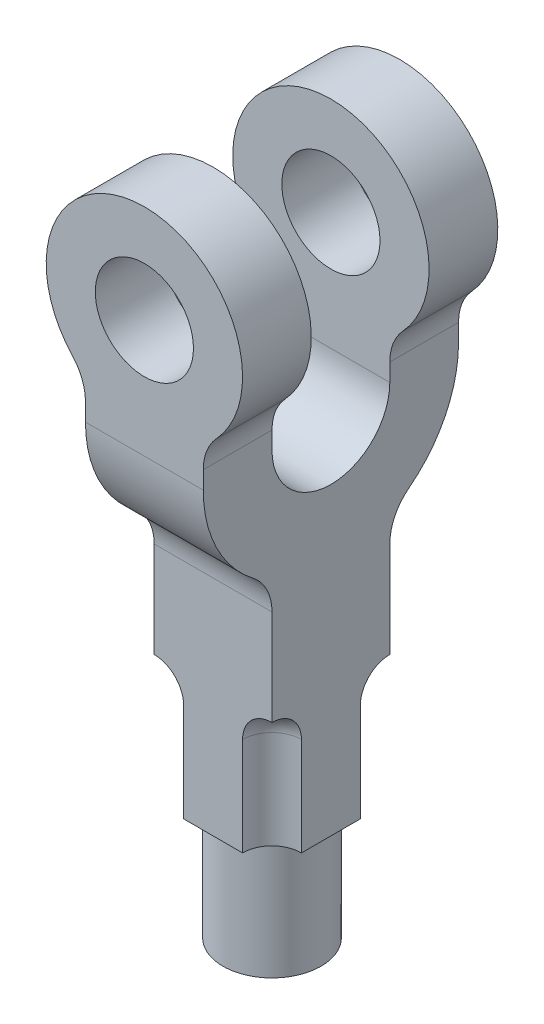
ISO-10303-21;
HEADER;
FILE_DESCRIPTION(('STEP AP214'),'2;1');
FILE_NAME('part.step','',(''),(''),'','','');
FILE_SCHEMA(('AUTOMOTIVE_DESIGN { 1 0 10303 214 1 1 1 1 }'));
ENDSEC;
DATA;
#1=APPLICATION_CONTEXT('core data for automotive mechanical design processes');
#2=APPLICATION_PROTOCOL_DEFINITION('international standard','automotive_design',2000,#1);
#3=PRODUCT_CONTEXT('',#1,'mechanical');
#4=PRODUCT('Part','Part','',(#3));
#5=PRODUCT_RELATED_PRODUCT_CATEGORY('part','',(#4));
#6=PRODUCT_DEFINITION_FORMATION('','',#4);
#7=PRODUCT_DEFINITION_CONTEXT('part definition',#1,'design');
#8=PRODUCT_DEFINITION('design','',#6,#7);
#9=PRODUCT_DEFINITION_SHAPE('','',#8);
#10=(LENGTH_UNIT() NAMED_UNIT(*) SI_UNIT(.MILLI.,.METRE.));
#11=(NAMED_UNIT(*) PLANE_ANGLE_UNIT() SI_UNIT($,.RADIAN.));
#12=(NAMED_UNIT(*) SI_UNIT($,.STERADIAN.) SOLID_ANGLE_UNIT());
#13=UNCERTAINTY_MEASURE_WITH_UNIT(LENGTH_MEASURE(1.E-05),#10,'distance_accuracy_value','');
#14=(GEOMETRIC_REPRESENTATION_CONTEXT(3) GLOBAL_UNCERTAINTY_ASSIGNED_CONTEXT((#13)) GLOBAL_UNIT_ASSIGNED_CONTEXT((#10,
#11,#12)) REPRESENTATION_CONTEXT('',''));
#15=CARTESIAN_POINT('',(0.,0.,0.));
#16=DIRECTION('',(0.,0.,1.));
#17=DIRECTION('',(1.,0.,0.));
#18=AXIS2_PLACEMENT_3D('',#15,#16,#17);
#19=CARTESIAN_POINT('',(24.,37.,12.));
#20=DIRECTION('',(0.,0.,1.));
#21=DIRECTION('',(0.,-1.,0.));
#22=AXIS2_PLACEMENT_3D('',#19,#20,#21);
#23=PLANE('',#22);
#24=CARTESIAN_POINT('',(12.,61.,12.));
#25=DIRECTION('',(0.,0.,1.));
#26=DIRECTION('',(0.,-1.,0.));
#27=AXIS2_PLACEMENT_3D('',#24,#25,#26);
#28=CIRCLE('',#27,10.);
#29=CARTESIAN_POINT('',(12.,51.,12.));
#30=VERTEX_POINT('',#29);
#31=EDGE_CURVE('E496',#30,#30,#28,.T.);
#32=ORIENTED_EDGE('',*,*,#31,.T.);
#33=EDGE_LOOP('',(#32));
#34=FACE_BOUND('',#33,.T.);
#35=DIRECTION('',(0.,1.,0.));
#36=VECTOR('',#35,1.);
#37=CARTESIAN_POINT('',(0.,37.,12.));
#38=LINE('',#37,#36);
#39=CARTESIAN_POINT('',(0.,37.,12.));
#40=VERTEX_POINT('',#39);
#41=CARTESIAN_POINT('',(0.,40.6039219456289,12.));
#42=VERTEX_POINT('',#41);
#43=EDGE_CURVE('E370',#40,#42,#38,.T.);
#44=ORIENTED_EDGE('',*,*,#43,.T.);
#45=CARTESIAN_POINT('',(-10.,40.6039219456289,12.));
#46=DIRECTION('',(0.,0.,1.));
#47=DIRECTION('',(0.,-1.,0.));
#48=AXIS2_PLACEMENT_3D('',#45,#46,#47);
#49=CIRCLE('',#48,10.);
#50=CARTESIAN_POINT('',(-2.66666666666667,47.4026146304192,12.));
#51=VERTEX_POINT('',#50);
#52=EDGE_CURVE('E528',#42,#51,#49,.T.);
#53=ORIENTED_EDGE('',*,*,#52,.T.);
#54=CARTESIAN_POINT('',(12.,61.,12.));
#55=DIRECTION('',(0.,0.,1.));
#56=DIRECTION('',(0.,-1.,0.));
#57=AXIS2_PLACEMENT_3D('',#54,#55,#56);
#58=CIRCLE('',#57,20.);
#59=CARTESIAN_POINT('',(26.6666666666667,47.4026146304192,12.));
#60=VERTEX_POINT('',#59);
#61=EDGE_CURVE('E732',#51,#60,#58,.F.);
#62=ORIENTED_EDGE('',*,*,#61,.T.);
#63=CARTESIAN_POINT('',(34.,40.6039219456289,12.));
#64=DIRECTION('',(0.,0.,1.));
#65=DIRECTION('',(0.,-1.,0.));
#66=AXIS2_PLACEMENT_3D('',#63,#64,#65);
#67=CIRCLE('',#66,10.);
#68=CARTESIAN_POINT('',(24.,40.6039219456289,12.));
#69=VERTEX_POINT('',#68);
#70=EDGE_CURVE('E540',#60,#69,#67,.T.);
#71=ORIENTED_EDGE('',*,*,#70,.T.);
#72=DIRECTION('',(0.,1.,0.));
#73=VECTOR('',#72,1.);
#74=CARTESIAN_POINT('',(24.,37.,12.));
#75=LINE('',#74,#73);
#76=CARTESIAN_POINT('',(24.,37.,12.));
#77=VERTEX_POINT('',#76);
#78=EDGE_CURVE('E450',#77,#69,#75,.T.);
#79=ORIENTED_EDGE('',*,*,#78,.F.);
#80=DIRECTION('',(-1.,0.,0.));
#81=VECTOR('',#80,1.);
#82=CARTESIAN_POINT('',(24.,37.,12.));
#83=LINE('',#82,#81);
#84=EDGE_CURVE('E396',#77,#40,#83,.T.);
#85=ORIENTED_EDGE('',*,*,#84,.T.);
#86=EDGE_LOOP('',(#44,#53,#62,#71,#79,#85));
#87=FACE_BOUND('',#86,.T.);
#88=ADVANCED_FACE('F117',(#34,#87),#23,.F.);
#89=CARTESIAN_POINT('',(24.,37.,26.));
#90=DIRECTION('',(0.,0.,1.));
#91=DIRECTION('',(0.,-1.,0.));
#92=AXIS2_PLACEMENT_3D('',#89,#90,#91);
#93=PLANE('',#92);
#94=CARTESIAN_POINT('',(12.,61.,26.));
#95=DIRECTION('',(0.,0.,1.));
#96=DIRECTION('',(1.,0.,0.));
#97=AXIS2_PLACEMENT_3D('',#94,#95,#96);
#98=CIRCLE('',#97,10.);
#99=CARTESIAN_POINT('',(22.,61.,26.));
#100=VERTEX_POINT('',#99);
#101=EDGE_CURVE('E1014',#100,#100,#98,.T.);
#102=ORIENTED_EDGE('',*,*,#101,.F.);
#103=EDGE_LOOP('',(#102));
#104=FACE_BOUND('',#103,.T.);
#105=DIRECTION('',(0.,1.,0.));
#106=VECTOR('',#105,1.);
#107=CARTESIAN_POINT('',(24.,37.,26.));
#108=LINE('',#107,#106);
#109=CARTESIAN_POINT('',(24.,37.,26.));
#110=VERTEX_POINT('',#109);
#111=CARTESIAN_POINT('',(24.,40.6039219456289,26.));
#112=VERTEX_POINT('',#111);
#113=EDGE_CURVE('E446',#110,#112,#108,.T.);
#114=ORIENTED_EDGE('',*,*,#113,.T.);
#115=CARTESIAN_POINT('',(34.,40.6039219456289,26.));
#116=DIRECTION('',(0.,0.,1.));
#117=DIRECTION('',(0.,-1.,0.));
#118=AXIS2_PLACEMENT_3D('',#115,#116,#117);
#119=CIRCLE('',#118,10.);
#120=CARTESIAN_POINT('',(26.6666666666667,47.4026146304192,26.));
#121=VERTEX_POINT('',#120);
#122=EDGE_CURVE('E537',#112,#121,#119,.F.);
#123=ORIENTED_EDGE('',*,*,#122,.T.);
#124=CARTESIAN_POINT('',(12.,61.,26.));
#125=DIRECTION('',(0.,0.,1.));
#126=DIRECTION('',(1.,0.,0.));
#127=AXIS2_PLACEMENT_3D('',#124,#125,#126);
#128=CIRCLE('',#127,20.);
#129=CARTESIAN_POINT('',(-2.66666666666667,47.4026146304192,26.));
#130=VERTEX_POINT('',#129);
#131=EDGE_CURVE('E726',#121,#130,#128,.T.);
#132=ORIENTED_EDGE('',*,*,#131,.T.);
#133=CARTESIAN_POINT('',(-10.,40.6039219456289,26.));
#134=DIRECTION('',(0.,0.,1.));
#135=DIRECTION('',(0.,-1.,0.));
#136=AXIS2_PLACEMENT_3D('',#133,#134,#135);
#137=CIRCLE('',#136,10.);
#138=CARTESIAN_POINT('',(0.,40.6039219456289,26.));
#139=VERTEX_POINT('',#138);
#140=EDGE_CURVE('E525',#130,#139,#137,.F.);
#141=ORIENTED_EDGE('',*,*,#140,.T.);
#142=DIRECTION('',(0.,1.,0.));
#143=VECTOR('',#142,1.);
#144=CARTESIAN_POINT('',(0.,37.,26.));
#145=LINE('',#144,#143);
#146=CARTESIAN_POINT('',(0.,37.,26.));
#147=VERTEX_POINT('',#146);
#148=EDGE_CURVE('E454',#147,#139,#145,.T.);
#149=ORIENTED_EDGE('',*,*,#148,.F.);
#150=DIRECTION('',(-1.,0.,0.));
#151=VECTOR('',#150,1.);
#152=CARTESIAN_POINT('',(24.,37.,26.));
#153=LINE('',#152,#151);
#154=EDGE_CURVE('E376',#110,#147,#153,.T.);
#155=ORIENTED_EDGE('',*,*,#154,.F.);
#156=EDGE_LOOP('',(#114,#123,#132,#141,#149,#155));
#157=FACE_BOUND('',#156,.T.);
#158=ADVANCED_FACE('F617',(#104,#157),#93,.T.);
#159=CARTESIAN_POINT('',(24.,37.,-26.));
#160=DIRECTION('',(0.,0.,1.));
#161=DIRECTION('',(0.,-1.,0.));
#162=AXIS2_PLACEMENT_3D('',#159,#160,#161);
#163=PLANE('',#162);
#164=CARTESIAN_POINT('',(12.,61.,-26.));
#165=DIRECTION('',(0.,0.,1.));
#166=DIRECTION('',(1.,0.,0.));
#167=AXIS2_PLACEMENT_3D('',#164,#165,#166);
#168=CIRCLE('',#167,10.);
#169=CARTESIAN_POINT('',(22.,61.,-26.));
#170=VERTEX_POINT('',#169);
#171=EDGE_CURVE('E497',#170,#170,#168,.T.);
#172=ORIENTED_EDGE('',*,*,#171,.T.);
#173=EDGE_LOOP('',(#172));
#174=FACE_BOUND('',#173,.T.);
#175=DIRECTION('',(0.,1.,0.));
#176=VECTOR('',#175,1.);
#177=CARTESIAN_POINT('',(0.,37.,-26.));
#178=LINE('',#177,#176);
#179=CARTESIAN_POINT('',(0.,37.,-26.));
#180=VERTEX_POINT('',#179);
#181=CARTESIAN_POINT('',(0.,40.6039219456289,-26.));
#182=VERTEX_POINT('',#181);
#183=EDGE_CURVE('E438',#180,#182,#178,.T.);
#184=ORIENTED_EDGE('',*,*,#183,.T.);
#185=CARTESIAN_POINT('',(-10.,40.6039219456289,-26.));
#186=DIRECTION('',(0.,0.,1.));
#187=DIRECTION('',(0.,-1.,0.));
#188=AXIS2_PLACEMENT_3D('',#185,#186,#187);
#189=CIRCLE('',#188,10.);
#190=CARTESIAN_POINT('',(-2.66666666666667,47.4026146304192,-26.));
#191=VERTEX_POINT('',#190);
#192=EDGE_CURVE('E534',#182,#191,#189,.T.);
#193=ORIENTED_EDGE('',*,*,#192,.T.);
#194=CARTESIAN_POINT('',(12.,61.,-26.));
#195=DIRECTION('',(0.,0.,1.));
#196=DIRECTION('',(1.,0.,0.));
#197=AXIS2_PLACEMENT_3D('',#194,#195,#196);
#198=CIRCLE('',#197,20.);
#199=CARTESIAN_POINT('',(26.6666666666667,47.4026146304192,-26.));
#200=VERTEX_POINT('',#199);
#201=EDGE_CURVE('E311',#200,#191,#198,.T.);
#202=ORIENTED_EDGE('',*,*,#201,.F.);
#203=CARTESIAN_POINT('',(34.,40.6039219456289,-26.));
#204=DIRECTION('',(0.,0.,1.));
#205=DIRECTION('',(0.,-1.,0.));
#206=AXIS2_PLACEMENT_3D('',#203,#204,#205);
#207=CIRCLE('',#206,10.);
#208=CARTESIAN_POINT('',(24.,40.6039219456289,-26.));
#209=VERTEX_POINT('',#208);
#210=EDGE_CURVE('E546',#200,#209,#207,.T.);
#211=ORIENTED_EDGE('',*,*,#210,.T.);
#212=DIRECTION('',(0.,1.,0.));
#213=VECTOR('',#212,1.);
#214=CARTESIAN_POINT('',(24.,37.,-26.));
#215=LINE('',#214,#213);
#216=CARTESIAN_POINT('',(24.,37.,-26.));
#217=VERTEX_POINT('',#216);
#218=EDGE_CURVE('E401',#217,#209,#215,.T.);
#219=ORIENTED_EDGE('',*,*,#218,.F.);
#220=DIRECTION('',(-1.,0.,0.));
#221=VECTOR('',#220,1.);
#222=CARTESIAN_POINT('',(24.,37.,-26.));
#223=LINE('',#222,#221);
#224=EDGE_CURVE('E421',#217,#180,#223,.T.);
#225=ORIENTED_EDGE('',*,*,#224,.T.);
#226=EDGE_LOOP('',(#184,#193,#202,#211,#219,#225));
#227=FACE_BOUND('',#226,.T.);
#228=ADVANCED_FACE('F624',(#174,#227),#163,.F.);
#229=CARTESIAN_POINT('',(24.,37.,-12.));
#230=DIRECTION('',(0.,0.,1.));
#231=DIRECTION('',(0.,-1.,0.));
#232=AXIS2_PLACEMENT_3D('',#229,#230,#231);
#233=PLANE('',#232);
#234=CARTESIAN_POINT('',(12.,61.,-12.));
#235=DIRECTION('',(0.,0.,1.));
#236=DIRECTION('',(0.,-1.,0.));
#237=AXIS2_PLACEMENT_3D('',#234,#235,#236);
#238=CIRCLE('',#237,10.);
#239=CARTESIAN_POINT('',(12.,51.,-12.));
#240=VERTEX_POINT('',#239);
#241=EDGE_CURVE('E492',#240,#240,#238,.T.);
#242=ORIENTED_EDGE('',*,*,#241,.F.);
#243=EDGE_LOOP('',(#242));
#244=FACE_BOUND('',#243,.T.);
#245=DIRECTION('',(0.,1.,0.));
#246=VECTOR('',#245,1.);
#247=CARTESIAN_POINT('',(24.,37.,-12.));
#248=LINE('',#247,#246);
#249=CARTESIAN_POINT('',(24.,37.,-12.));
#250=VERTEX_POINT('',#249);
#251=CARTESIAN_POINT('',(24.,40.6039219456289,-12.));
#252=VERTEX_POINT('',#251);
#253=EDGE_CURVE('E434',#250,#252,#248,.T.);
#254=ORIENTED_EDGE('',*,*,#253,.T.);
#255=CARTESIAN_POINT('',(34.,40.6039219456289,-12.));
#256=DIRECTION('',(0.,0.,1.));
#257=DIRECTION('',(0.,-1.,0.));
#258=AXIS2_PLACEMENT_3D('',#255,#256,#257);
#259=CIRCLE('',#258,10.);
#260=CARTESIAN_POINT('',(26.6666666666667,47.4026146304192,-12.));
#261=VERTEX_POINT('',#260);
#262=EDGE_CURVE('E543',#252,#261,#259,.F.);
#263=ORIENTED_EDGE('',*,*,#262,.T.);
#264=CARTESIAN_POINT('',(12.,61.,-12.));
#265=DIRECTION('',(0.,0.,1.));
#266=DIRECTION('',(1.,0.,0.));
#267=AXIS2_PLACEMENT_3D('',#264,#265,#266);
#268=CIRCLE('',#267,20.);
#269=CARTESIAN_POINT('',(-2.66666666666667,47.4026146304192,-12.));
#270=VERTEX_POINT('',#269);
#271=EDGE_CURVE('E736',#261,#270,#268,.T.);
#272=ORIENTED_EDGE('',*,*,#271,.T.);
#273=CARTESIAN_POINT('',(-10.,40.6039219456289,-12.));
#274=DIRECTION('',(0.,0.,1.));
#275=DIRECTION('',(0.,-1.,0.));
#276=AXIS2_PLACEMENT_3D('',#273,#274,#275);
#277=CIRCLE('',#276,10.);
#278=CARTESIAN_POINT('',(0.,40.6039219456289,-12.));
#279=VERTEX_POINT('',#278);
#280=EDGE_CURVE('E531',#270,#279,#277,.F.);
#281=ORIENTED_EDGE('',*,*,#280,.T.);
#282=DIRECTION('',(0.,1.,0.));
#283=VECTOR('',#282,1.);
#284=CARTESIAN_POINT('',(0.,37.,-12.));
#285=LINE('',#284,#283);
#286=CARTESIAN_POINT('',(0.,37.,-12.));
#287=VERTEX_POINT('',#286);
#288=EDGE_CURVE('E442',#287,#279,#285,.T.);
#289=ORIENTED_EDGE('',*,*,#288,.F.);
#290=DIRECTION('',(-1.,0.,0.));
#291=VECTOR('',#290,1.);
#292=CARTESIAN_POINT('',(24.,37.,-12.));
#293=LINE('',#292,#291);
#294=EDGE_CURVE('E418',#250,#287,#293,.T.);
#295=ORIENTED_EDGE('',*,*,#294,.F.);
#296=EDGE_LOOP('',(#254,#263,#272,#281,#289,#295));
#297=FACE_BOUND('',#296,.T.);
#298=ADVANCED_FACE('F700',(#244,#297),#233,.T.);
#299=CARTESIAN_POINT('',(24.,37.,0.));
#300=DIRECTION('',(-1.,0.,0.));
#301=DIRECTION('',(0.,0.,1.));
#302=AXIS2_PLACEMENT_3D('',#299,#300,#301);
#303=CYLINDRICAL_SURFACE('',#302,26.);
#304=CARTESIAN_POINT('',(0.,37.,0.));
#305=DIRECTION('',(1.,0.,0.));
#306=DIRECTION('',(0.,0.,-1.));
#307=AXIS2_PLACEMENT_3D('',#304,#305,#306);
#308=CIRCLE('',#307,26.);
#309=CARTESIAN_POINT('',(0.,16.4198345517694,15.8888888888889));
#310=VERTEX_POINT('',#309);
#311=EDGE_CURVE('E397',#147,#310,#308,.T.);
#312=ORIENTED_EDGE('',*,*,#311,.T.);
#313=DIRECTION('',(-1.,0.,0.));
#314=VECTOR('',#313,1.);
#315=CARTESIAN_POINT('',(24.,16.4198345517694,15.8888888888889));
#316=LINE('',#315,#314);
#317=CARTESIAN_POINT('',(24.,16.4198345517694,15.8888888888889));
#318=VERTEX_POINT('',#317);
#319=EDGE_CURVE('E133',#310,#318,#316,.F.);
#320=ORIENTED_EDGE('',*,*,#319,.T.);
#321=CARTESIAN_POINT('',(24.,37.,0.));
#322=DIRECTION('',(1.,0.,0.));
#323=DIRECTION('',(0.,0.,-1.));
#324=AXIS2_PLACEMENT_3D('',#321,#322,#323);
#325=CIRCLE('',#324,26.);
#326=EDGE_CURVE('E377',#110,#318,#325,.T.);
#327=ORIENTED_EDGE('',*,*,#326,.F.);
#328=ORIENTED_EDGE('',*,*,#154,.T.);
#329=EDGE_LOOP('',(#312,#320,#327,#328));
#330=FACE_BOUND('',#329,.T.);
#331=ADVANCED_FACE('F697',(#330),#303,.T.);
#332=CARTESIAN_POINT('',(24.,0.,12.));
#333=DIRECTION('',(0.,0.,-1.));
#334=DIRECTION('',(0.,1.,0.));
#335=AXIS2_PLACEMENT_3D('',#332,#333,#334);
#336=PLANE('',#335);
#337=DIRECTION('',(0.,-1.,0.));
#338=VECTOR('',#337,1.);
#339=CARTESIAN_POINT('',(24.,0.,12.));
#340=LINE('',#339,#338);
#341=CARTESIAN_POINT('',(24.,8.50438630244999,12.));
#342=VERTEX_POINT('',#341);
#343=CARTESIAN_POINT('',(24.,-11.,12.));
#344=VERTEX_POINT('',#343);
#345=EDGE_CURVE('E380',#342,#344,#340,.T.);
#346=ORIENTED_EDGE('',*,*,#345,.F.);
#347=DIRECTION('',(1.,0.,0.));
#348=VECTOR('',#347,1.);
#349=CARTESIAN_POINT('',(0.,8.50438630244999,12.));
#350=LINE('',#349,#348);
#351=CARTESIAN_POINT('',(0.,8.50438630244999,12.));
#352=VERTEX_POINT('',#351);
#353=EDGE_CURVE('E556',#342,#352,#350,.F.);
#354=ORIENTED_EDGE('',*,*,#353,.T.);
#355=DIRECTION('',(0.,-1.,0.));
#356=VECTOR('',#355,1.);
#357=CARTESIAN_POINT('',(0.,0.,12.));
#358=LINE('',#357,#356);
#359=CARTESIAN_POINT('',(0.,-11.,12.));
#360=VERTEX_POINT('',#359);
#361=EDGE_CURVE('E400',#352,#360,#358,.T.);
#362=ORIENTED_EDGE('',*,*,#361,.T.);
#363=CARTESIAN_POINT('',(0.,-17.,12.));
#364=DIRECTION('',(0.,0.,-1.));
#365=DIRECTION('',(0.,1.,0.));
#366=AXIS2_PLACEMENT_3D('',#363,#364,#365);
#367=CIRCLE('',#366,6.);
#368=CARTESIAN_POINT('',(5.99999999999996,-17.,12.));
#369=VERTEX_POINT('',#368);
#370=EDGE_CURVE('E345',#369,#360,#367,.F.);
#371=ORIENTED_EDGE('',*,*,#370,.F.);
#372=DIRECTION('',(0.,1.,0.));
#373=VECTOR('',#372,1.);
#374=CARTESIAN_POINT('',(5.99999999999996,13.9348748106584,12.));
#375=LINE('',#374,#373);
#376=CARTESIAN_POINT('',(5.99999999999996,-37.,12.));
#377=VERTEX_POINT('',#376);
#378=EDGE_CURVE('E349',#377,#369,#375,.T.);
#379=ORIENTED_EDGE('',*,*,#378,.F.);
#380=DIRECTION('',(-1.,0.,0.));
#381=VECTOR('',#380,1.);
#382=CARTESIAN_POINT('',(24.,-37.,12.));
#383=LINE('',#382,#381);
#384=CARTESIAN_POINT('',(18.,-37.,12.));
#385=VERTEX_POINT('',#384);
#386=EDGE_CURVE('E428',#385,#377,#383,.T.);
#387=ORIENTED_EDGE('',*,*,#386,.F.);
#388=DIRECTION('',(0.,1.,0.));
#389=VECTOR('',#388,1.);
#390=CARTESIAN_POINT('',(18.,13.9348748106584,12.));
#391=LINE('',#390,#389);
#392=CARTESIAN_POINT('',(18.,-17.,12.));
#393=VERTEX_POINT('',#392);
#394=EDGE_CURVE('E363',#393,#385,#391,.F.);
#395=ORIENTED_EDGE('',*,*,#394,.F.);
#396=CARTESIAN_POINT('',(24.,-17.,12.));
#397=DIRECTION('',(0.,0.,-1.));
#398=DIRECTION('',(0.,1.,0.));
#399=AXIS2_PLACEMENT_3D('',#396,#397,#398);
#400=CIRCLE('',#399,6.);
#401=EDGE_CURVE('E360',#344,#393,#400,.F.);
#402=ORIENTED_EDGE('',*,*,#401,.F.);
#403=EDGE_LOOP('',(#346,#354,#362,#371,#379,#387,#395,#402));
#404=FACE_BOUND('',#403,.T.);
#405=ADVANCED_FACE('F602',(#404),#336,.F.);
#406=CARTESIAN_POINT('',(24.,-37.,0.));
#407=DIRECTION('',(0.,-1.,0.));
#408=DIRECTION('',(0.,0.,-1.));
#409=AXIS2_PLACEMENT_3D('',#406,#407,#408);
#410=PLANE('',#409);
#411=CARTESIAN_POINT('',(12.,-37.,0.));
#412=DIRECTION('',(0.,-1.,0.));
#413=DIRECTION('',(0.,0.,-1.));
#414=AXIS2_PLACEMENT_3D('',#411,#412,#413);
#415=CIRCLE('',#414,10.);
#416=CARTESIAN_POINT('',(12.,-37.,-10.));
#417=VERTEX_POINT('',#416);
#418=EDGE_CURVE('E371',#417,#417,#415,.T.);
#419=ORIENTED_EDGE('',*,*,#418,.F.);
#420=EDGE_LOOP('',(#419));
#421=FACE_BOUND('',#420,.T.);
#422=DIRECTION('',(-1.,0.,0.));
#423=VECTOR('',#422,1.);
#424=CARTESIAN_POINT('',(24.,-37.,-12.));
#425=LINE('',#424,#423);
#426=CARTESIAN_POINT('',(18.0000000000001,-37.,-12.));
#427=VERTEX_POINT('',#426);
#428=CARTESIAN_POINT('',(6.,-37.,-12.));
#429=VERTEX_POINT('',#428);
#430=EDGE_CURVE('E425',#427,#429,#425,.T.);
#431=ORIENTED_EDGE('',*,*,#430,.F.);
#432=CARTESIAN_POINT('',(24.0000000000001,-37.,-11.9999999999999));
#433=DIRECTION('',(0.,1.,0.));
#434=DIRECTION('',(1.,0.,0.));
#435=AXIS2_PLACEMENT_3D('',#432,#433,#434);
#436=CIRCLE('',#435,6.);
#437=CARTESIAN_POINT('',(24.,-37.,-5.99999999999988));
#438=VERTEX_POINT('',#437);
#439=EDGE_CURVE('E297',#427,#438,#436,.T.);
#440=ORIENTED_EDGE('',*,*,#439,.T.);
#441=DIRECTION('',(0.,0.,1.));
#442=VECTOR('',#441,1.);
#443=CARTESIAN_POINT('',(24.,-37.,0.));
#444=LINE('',#443,#442);
#445=CARTESIAN_POINT('',(24.,-37.,5.99999999999999));
#446=VERTEX_POINT('',#445);
#447=EDGE_CURVE('E384',#438,#446,#444,.T.);
#448=ORIENTED_EDGE('',*,*,#447,.T.);
#449=CARTESIAN_POINT('',(24.,-37.,12.));
#450=DIRECTION('',(0.,1.,0.));
#451=DIRECTION('',(0.,0.,1.));
#452=AXIS2_PLACEMENT_3D('',#449,#450,#451);
#453=CIRCLE('',#452,6.);
#454=EDGE_CURVE('E356',#446,#385,#453,.T.);
#455=ORIENTED_EDGE('',*,*,#454,.T.);
#456=ORIENTED_EDGE('',*,*,#386,.T.);
#457=CARTESIAN_POINT('',(0.,-37.,12.));
#458=DIRECTION('',(0.,1.,0.));
#459=DIRECTION('',(-1.,0.,0.));
#460=AXIS2_PLACEMENT_3D('',#457,#458,#459);
#461=CIRCLE('',#460,6.);
#462=CARTESIAN_POINT('',(0.,-37.,5.99999999999996));
#463=VERTEX_POINT('',#462);
#464=EDGE_CURVE('E341',#377,#463,#461,.T.);
#465=ORIENTED_EDGE('',*,*,#464,.T.);
#466=DIRECTION('',(0.,0.,1.));
#467=VECTOR('',#466,1.);
#468=CARTESIAN_POINT('',(0.,-37.,0.));
#469=LINE('',#468,#467);
#470=CARTESIAN_POINT('',(0.,-37.,-5.99999999999999));
#471=VERTEX_POINT('',#470);
#472=EDGE_CURVE('E404',#471,#463,#469,.T.);
#473=ORIENTED_EDGE('',*,*,#472,.F.);
#474=CARTESIAN_POINT('',(0.,-37.,-12.));
#475=DIRECTION('',(0.,1.,0.));
#476=DIRECTION('',(0.,0.,-1.));
#477=AXIS2_PLACEMENT_3D('',#474,#475,#476);
#478=CIRCLE('',#477,6.);
#479=EDGE_CURVE('E325',#471,#429,#478,.T.);
#480=ORIENTED_EDGE('',*,*,#479,.T.);
#481=EDGE_LOOP('',(#431,#440,#448,#455,#456,#465,#473,#480));
#482=FACE_BOUND('',#481,.T.);
#483=ADVANCED_FACE('F593',(#421,#482),#410,.T.);
#484=CARTESIAN_POINT('',(24.,0.,-12.));
#485=DIRECTION('',(0.,0.,-1.));
#486=DIRECTION('',(0.,1.,0.));
#487=AXIS2_PLACEMENT_3D('',#484,#485,#486);
#488=PLANE('',#487);
#489=DIRECTION('',(0.,-1.,0.));
#490=VECTOR('',#489,1.);
#491=CARTESIAN_POINT('',(0.,0.,-12.));
#492=LINE('',#491,#490);
#493=CARTESIAN_POINT('',(0.,8.50438630244998,-12.));
#494=VERTEX_POINT('',#493);
#495=CARTESIAN_POINT('',(0.,-11.,-12.));
#496=VERTEX_POINT('',#495);
#497=EDGE_CURVE('E407',#494,#496,#492,.T.);
#498=ORIENTED_EDGE('',*,*,#497,.F.);
#499=DIRECTION('',(-1.,0.,0.));
#500=VECTOR('',#499,1.);
#501=CARTESIAN_POINT('',(24.,8.50438630244998,-12.));
#502=LINE('',#501,#500);
#503=CARTESIAN_POINT('',(24.,8.50438630244998,-12.));
#504=VERTEX_POINT('',#503);
#505=EDGE_CURVE('E553',#494,#504,#502,.F.);
#506=ORIENTED_EDGE('',*,*,#505,.T.);
#507=DIRECTION('',(0.,-1.,0.));
#508=VECTOR('',#507,1.);
#509=CARTESIAN_POINT('',(24.,0.,-12.));
#510=LINE('',#509,#508);
#511=CARTESIAN_POINT('',(24.,-11.,-12.));
#512=VERTEX_POINT('',#511);
#513=EDGE_CURVE('E316',#504,#512,#510,.T.);
#514=ORIENTED_EDGE('',*,*,#513,.T.);
#515=CARTESIAN_POINT('',(24.0000000000001,-17.,-12.));
#516=DIRECTION('',(0.,0.,-1.));
#517=DIRECTION('',(0.,1.,0.));
#518=AXIS2_PLACEMENT_3D('',#515,#516,#517);
#519=CIRCLE('',#518,6.);
#520=CARTESIAN_POINT('',(18.0000000000001,-17.,-12.));
#521=VERTEX_POINT('',#520);
#522=EDGE_CURVE('E303',#512,#521,#519,.F.);
#523=ORIENTED_EDGE('',*,*,#522,.T.);
#524=DIRECTION('',(0.,1.,0.));
#525=VECTOR('',#524,1.);
#526=CARTESIAN_POINT('',(18.0000000000001,13.9348748106584,-12.));
#527=LINE('',#526,#525);
#528=EDGE_CURVE('E291',#521,#427,#527,.F.);
#529=ORIENTED_EDGE('',*,*,#528,.T.);
#530=ORIENTED_EDGE('',*,*,#430,.T.);
#531=DIRECTION('',(0.,1.,0.));
#532=VECTOR('',#531,1.);
#533=CARTESIAN_POINT('',(6.,13.9348748106584,-12.));
#534=LINE('',#533,#532);
#535=CARTESIAN_POINT('',(6.,-17.,-12.));
#536=VERTEX_POINT('',#535);
#537=EDGE_CURVE('E333',#429,#536,#534,.T.);
#538=ORIENTED_EDGE('',*,*,#537,.T.);
#539=CARTESIAN_POINT('',(0.,-17.,-12.));
#540=DIRECTION('',(0.,0.,-1.));
#541=DIRECTION('',(0.,1.,0.));
#542=AXIS2_PLACEMENT_3D('',#539,#540,#541);
#543=CIRCLE('',#542,6.);
#544=EDGE_CURVE('E329',#536,#496,#543,.F.);
#545=ORIENTED_EDGE('',*,*,#544,.T.);
#546=EDGE_LOOP('',(#498,#506,#514,#523,#529,#530,#538,#545));
#547=FACE_BOUND('',#546,.T.);
#548=ADVANCED_FACE('F314',(#547),#488,.T.);
#549=CARTESIAN_POINT('',(24.,37.,0.));
#550=DIRECTION('',(-1.,0.,0.));
#551=DIRECTION('',(0.,0.,1.));
#552=AXIS2_PLACEMENT_3D('',#549,#550,#551);
#553=CYLINDRICAL_SURFACE('',#552,26.);
#554=CARTESIAN_POINT('',(24.,37.,0.));
#555=DIRECTION('',(1.,0.,0.));
#556=DIRECTION('',(0.,0.,-1.));
#557=AXIS2_PLACEMENT_3D('',#554,#555,#556);
#558=CIRCLE('',#557,26.);
#559=CARTESIAN_POINT('',(24.,16.4198345517694,-15.8888888888889));
#560=VERTEX_POINT('',#559);
#561=EDGE_CURVE('E389',#560,#217,#558,.T.);
#562=ORIENTED_EDGE('',*,*,#561,.F.);
#563=DIRECTION('',(-1.,0.,0.));
#564=VECTOR('',#563,1.);
#565=CARTESIAN_POINT('',(24.,16.4198345517694,-15.8888888888889));
#566=LINE('',#565,#564);
#567=CARTESIAN_POINT('',(0.,16.4198345517694,-15.8888888888889));
#568=VERTEX_POINT('',#567);
#569=EDGE_CURVE('E549',#560,#568,#566,.T.);
#570=ORIENTED_EDGE('',*,*,#569,.T.);
#571=CARTESIAN_POINT('',(0.,37.,0.));
#572=DIRECTION('',(1.,0.,0.));
#573=DIRECTION('',(0.,0.,-1.));
#574=AXIS2_PLACEMENT_3D('',#571,#572,#573);
#575=CIRCLE('',#574,26.);
#576=EDGE_CURVE('E410',#568,#180,#575,.T.);
#577=ORIENTED_EDGE('',*,*,#576,.T.);
#578=ORIENTED_EDGE('',*,*,#224,.F.);
#579=EDGE_LOOP('',(#562,#570,#577,#578));
#580=FACE_BOUND('',#579,.T.);
#581=ADVANCED_FACE('F577',(#580),#553,.T.);
#582=CARTESIAN_POINT('',(24.,37.,0.));
#583=DIRECTION('',(-1.,0.,0.));
#584=DIRECTION('',(0.,0.,1.));
#585=AXIS2_PLACEMENT_3D('',#582,#583,#584);
#586=CYLINDRICAL_SURFACE('',#585,12.);
#587=CARTESIAN_POINT('',(0.,37.,0.));
#588=DIRECTION('',(1.,0.,0.));
#589=DIRECTION('',(0.,0.,-1.));
#590=AXIS2_PLACEMENT_3D('',#587,#588,#589);
#591=CIRCLE('',#590,12.);
#592=EDGE_CURVE('E381',#40,#287,#591,.T.);
#593=ORIENTED_EDGE('',*,*,#592,.F.);
#594=ORIENTED_EDGE('',*,*,#84,.F.);
#595=CARTESIAN_POINT('',(24.,37.,0.));
#596=DIRECTION('',(1.,0.,0.));
#597=DIRECTION('',(0.,0.,-1.));
#598=AXIS2_PLACEMENT_3D('',#595,#596,#597);
#599=CIRCLE('',#598,12.);
#600=EDGE_CURVE('E392',#77,#250,#599,.T.);
#601=ORIENTED_EDGE('',*,*,#600,.T.);
#602=ORIENTED_EDGE('',*,*,#294,.T.);
#603=EDGE_LOOP('',(#593,#594,#601,#602));
#604=FACE_BOUND('',#603,.T.);
#605=ADVANCED_FACE('F684',(#604),#586,.F.);
#606=CARTESIAN_POINT('',(0.,0.,0.));
#607=DIRECTION('',(1.,0.,0.));
#608=DIRECTION('',(0.,0.,-1.));
#609=AXIS2_PLACEMENT_3D('',#606,#607,#608);
#610=PLANE('',#609);
#611=ORIENTED_EDGE('',*,*,#148,.T.);
#612=DIRECTION('',(0.,0.,1.));
#613=VECTOR('',#612,1.);
#614=CARTESIAN_POINT('',(0.,40.6039219456289,0.));
#615=LINE('',#614,#613);
#616=EDGE_CURVE('E507',#139,#42,#615,.F.);
#617=ORIENTED_EDGE('',*,*,#616,.T.);
#618=ORIENTED_EDGE('',*,*,#43,.F.);
#619=ORIENTED_EDGE('',*,*,#592,.T.);
#620=ORIENTED_EDGE('',*,*,#288,.T.);
#621=DIRECTION('',(0.,0.,1.));
#622=VECTOR('',#621,1.);
#623=CARTESIAN_POINT('',(0.,40.6039219456289,0.));
#624=LINE('',#623,#622);
#625=EDGE_CURVE('E504',#279,#182,#624,.F.);
#626=ORIENTED_EDGE('',*,*,#625,.T.);
#627=ORIENTED_EDGE('',*,*,#183,.F.);
#628=ORIENTED_EDGE('',*,*,#576,.F.);
#629=CARTESIAN_POINT('',(0.,8.50438630244998,-22.));
#630=DIRECTION('',(1.,0.,0.));
#631=DIRECTION('',(0.,0.,-1.));
#632=AXIS2_PLACEMENT_3D('',#629,#630,#631);
#633=CIRCLE('',#632,10.);
#634=EDGE_CURVE('E562',#568,#494,#633,.T.);
#635=ORIENTED_EDGE('',*,*,#634,.T.);
#636=ORIENTED_EDGE('',*,*,#497,.T.);
#637=CARTESIAN_POINT('',(0.,-17.,-12.));
#638=DIRECTION('',(1.,0.,0.));
#639=DIRECTION('',(0.,0.,-1.));
#640=AXIS2_PLACEMENT_3D('',#637,#638,#639);
#641=CIRCLE('',#640,6.);
#642=CARTESIAN_POINT('',(0.,-17.,-5.99999999999999));
#643=VERTEX_POINT('',#642);
#644=EDGE_CURVE('E478',#643,#496,#641,.F.);
#645=ORIENTED_EDGE('',*,*,#644,.F.);
#646=DIRECTION('',(0.,1.,0.));
#647=VECTOR('',#646,1.);
#648=CARTESIAN_POINT('',(0.,13.9348748106584,-6.));
#649=LINE('',#648,#647);
#650=EDGE_CURVE('E482',#471,#643,#649,.T.);
#651=ORIENTED_EDGE('',*,*,#650,.F.);
#652=ORIENTED_EDGE('',*,*,#472,.T.);
#653=DIRECTION('',(0.,1.,0.));
#654=VECTOR('',#653,1.);
#655=CARTESIAN_POINT('',(0.,13.9348748106584,5.99999999999996));
#656=LINE('',#655,#654);
#657=CARTESIAN_POINT('',(0.,-17.,5.99999999999996));
#658=VERTEX_POINT('',#657);
#659=EDGE_CURVE('E474',#658,#463,#656,.F.);
#660=ORIENTED_EDGE('',*,*,#659,.F.);
#661=CARTESIAN_POINT('',(0.,-17.,12.));
#662=DIRECTION('',(1.,0.,0.));
#663=DIRECTION('',(0.,0.,-1.));
#664=AXIS2_PLACEMENT_3D('',#661,#662,#663);
#665=CIRCLE('',#664,6.);
#666=EDGE_CURVE('E471',#360,#658,#665,.F.);
#667=ORIENTED_EDGE('',*,*,#666,.F.);
#668=ORIENTED_EDGE('',*,*,#361,.F.);
#669=CARTESIAN_POINT('',(0.,8.50438630244998,22.));
#670=DIRECTION('',(1.,0.,0.));
#671=DIRECTION('',(0.,0.,-1.));
#672=AXIS2_PLACEMENT_3D('',#669,#670,#671);
#673=CIRCLE('',#672,10.);
#674=EDGE_CURVE('E126',#352,#310,#673,.T.);
#675=ORIENTED_EDGE('',*,*,#674,.T.);
#676=ORIENTED_EDGE('',*,*,#311,.F.);
#677=EDGE_LOOP('',(#611,#617,#618,#619,#620,#626,#627,#628,#635,#636,#645,#651,#652,#660,#667,
#668,#675,#676));
#678=FACE_BOUND('',#677,.T.);
#679=ADVANCED_FACE('F581',(#678),#610,.F.);
#680=CARTESIAN_POINT('',(24.,0.,0.));
#681=DIRECTION('',(1.,0.,0.));
#682=DIRECTION('',(0.,0.,-1.));
#683=AXIS2_PLACEMENT_3D('',#680,#681,#682);
#684=PLANE('',#683);
#685=ORIENTED_EDGE('',*,*,#78,.T.);
#686=DIRECTION('',(0.,0.,-1.));
#687=VECTOR('',#686,1.);
#688=CARTESIAN_POINT('',(24.,40.6039219456289,26.));
#689=LINE('',#688,#687);
#690=EDGE_CURVE('E521',#69,#112,#689,.F.);
#691=ORIENTED_EDGE('',*,*,#690,.T.);
#692=ORIENTED_EDGE('',*,*,#113,.F.);
#693=ORIENTED_EDGE('',*,*,#326,.T.);
#694=CARTESIAN_POINT('',(24.,8.50438630244998,22.));
#695=DIRECTION('',(1.,0.,0.));
#696=DIRECTION('',(0.,0.,-1.));
#697=AXIS2_PLACEMENT_3D('',#694,#695,#696);
#698=CIRCLE('',#697,10.);
#699=EDGE_CURVE('E12',#318,#342,#698,.F.);
#700=ORIENTED_EDGE('',*,*,#699,.T.);
#701=ORIENTED_EDGE('',*,*,#345,.T.);
#702=CARTESIAN_POINT('',(24.,-17.,12.));
#703=DIRECTION('',(1.,0.,0.));
#704=DIRECTION('',(0.,0.,-1.));
#705=AXIS2_PLACEMENT_3D('',#702,#703,#704);
#706=CIRCLE('',#705,6.);
#707=CARTESIAN_POINT('',(24.,-17.,5.99999999999999));
#708=VERTEX_POINT('',#707);
#709=EDGE_CURVE('E375',#344,#708,#706,.F.);
#710=ORIENTED_EDGE('',*,*,#709,.T.);
#711=DIRECTION('',(0.,1.,0.));
#712=VECTOR('',#711,1.);
#713=CARTESIAN_POINT('',(24.,13.9348748106584,6.));
#714=LINE('',#713,#712);
#715=EDGE_CURVE('E467',#708,#446,#714,.F.);
#716=ORIENTED_EDGE('',*,*,#715,.T.);
#717=ORIENTED_EDGE('',*,*,#447,.F.);
#718=DIRECTION('',(0.,1.,0.));
#719=VECTOR('',#718,1.);
#720=CARTESIAN_POINT('',(24.,13.9348748106584,-5.99999999999988));
#721=LINE('',#720,#719);
#722=CARTESIAN_POINT('',(24.,-17.,-5.99999999999988));
#723=VERTEX_POINT('',#722);
#724=EDGE_CURVE('E488',#438,#723,#721,.T.);
#725=ORIENTED_EDGE('',*,*,#724,.T.);
#726=CARTESIAN_POINT('',(24.,-17.,-11.9999999999999));
#727=DIRECTION('',(1.,0.,0.));
#728=DIRECTION('',(0.,0.,-1.));
#729=AXIS2_PLACEMENT_3D('',#726,#727,#728);
#730=CIRCLE('',#729,6.);
#731=EDGE_CURVE('E309',#723,#512,#730,.F.);
#732=ORIENTED_EDGE('',*,*,#731,.T.);
#733=ORIENTED_EDGE('',*,*,#513,.F.);
#734=CARTESIAN_POINT('',(24.,8.50438630244998,-22.));
#735=DIRECTION('',(1.,0.,0.));
#736=DIRECTION('',(0.,0.,-1.));
#737=AXIS2_PLACEMENT_3D('',#734,#735,#736);
#738=CIRCLE('',#737,10.);
#739=EDGE_CURVE('E565',#504,#560,#738,.F.);
#740=ORIENTED_EDGE('',*,*,#739,.T.);
#741=ORIENTED_EDGE('',*,*,#561,.T.);
#742=ORIENTED_EDGE('',*,*,#218,.T.);
#743=DIRECTION('',(0.,0.,-1.));
#744=VECTOR('',#743,1.);
#745=CARTESIAN_POINT('',(24.,40.6039219456289,-12.));
#746=LINE('',#745,#744);
#747=EDGE_CURVE('E517',#209,#252,#746,.F.);
#748=ORIENTED_EDGE('',*,*,#747,.T.);
#749=ORIENTED_EDGE('',*,*,#253,.F.);
#750=ORIENTED_EDGE('',*,*,#600,.F.);
#751=EDGE_LOOP('',(#685,#691,#692,#693,#700,#701,#710,#716,#717,#725,#732,#733,#740,#741,#742,
#748,#749,#750));
#752=FACE_BOUND('',#751,.T.);
#753=ADVANCED_FACE('F571',(#752),#684,.T.);
#754=CARTESIAN_POINT('',(12.,-61.,0.));
#755=DIRECTION('',(0.,1.,0.));
#756=DIRECTION('',(0.,0.,1.));
#757=AXIS2_PLACEMENT_3D('',#754,#755,#756);
#758=CYLINDRICAL_SURFACE('',#757,10.);
#759=CARTESIAN_POINT('',(12.,-61.,0.));
#760=DIRECTION('',(0.,-1.,0.));
#761=DIRECTION('',(0.,0.,-1.));
#762=AXIS2_PLACEMENT_3D('',#759,#760,#761);
#763=CIRCLE('',#762,10.);
#764=CARTESIAN_POINT('',(12.,-61.,-10.));
#765=VERTEX_POINT('',#764);
#766=EDGE_CURVE('E366',#765,#765,#763,.T.);
#767=ORIENTED_EDGE('',*,*,#766,.F.);
#768=EDGE_LOOP('',(#767));
#769=FACE_BOUND('',#768,.T.);
#770=ORIENTED_EDGE('',*,*,#418,.T.);
#771=EDGE_LOOP('',(#770));
#772=FACE_BOUND('',#771,.T.);
#773=ADVANCED_FACE('F674',(#769,#772),#758,.T.);
#774=CARTESIAN_POINT('',(12.,-61.,0.));
#775=DIRECTION('',(0.,-1.,0.));
#776=DIRECTION('',(0.,0.,-1.));
#777=AXIS2_PLACEMENT_3D('',#774,#775,#776);
#778=PLANE('',#777);
#779=ORIENTED_EDGE('',*,*,#766,.T.);
#780=EDGE_LOOP('',(#779));
#781=FACE_BOUND('',#780,.T.);
#782=ADVANCED_FACE('F667',(#781),#778,.T.);
#783=CARTESIAN_POINT('',(24.,13.9348748106584,12.));
#784=DIRECTION('',(0.,1.,0.));
#785=DIRECTION('',(0.,0.,1.));
#786=AXIS2_PLACEMENT_3D('',#783,#784,#785);
#787=CYLINDRICAL_SURFACE('',#786,6.);
#788=ORIENTED_EDGE('',*,*,#394,.T.);
#789=ORIENTED_EDGE('',*,*,#454,.F.);
#790=ORIENTED_EDGE('',*,*,#715,.F.);
#791=CARTESIAN_POINT('',(24.,-17.,12.));
#792=DIRECTION('',(0.,1.,0.));
#793=DIRECTION('',(0.,0.,1.));
#794=AXIS2_PLACEMENT_3D('',#791,#792,#793);
#795=CIRCLE('',#794,6.);
#796=EDGE_CURVE('E352',#708,#393,#795,.T.);
#797=ORIENTED_EDGE('',*,*,#796,.T.);
#798=EDGE_LOOP('',(#788,#789,#790,#797));
#799=FACE_BOUND('',#798,.T.);
#800=ADVANCED_FACE('F663',(#799),#787,.F.);
#801=CARTESIAN_POINT('',(24.,-17.,12.));
#802=DIRECTION('',(0.,1.,0.));
#803=DIRECTION('',(0.,0.,-1.));
#804=AXIS2_PLACEMENT_3D('',#801,#802,#803);
#805=SPHERICAL_SURFACE('',#804,6.);
#806=ORIENTED_EDGE('',*,*,#401,.T.);
#807=ORIENTED_EDGE('',*,*,#796,.F.);
#808=ORIENTED_EDGE('',*,*,#709,.F.);
#809=EDGE_LOOP('',(#806,#807,#808));
#810=FACE_BOUND('',#809,.T.);
#811=ADVANCED_FACE('F614',(#810),#805,.F.);
#812=CARTESIAN_POINT('',(0.,13.9348748106584,12.));
#813=DIRECTION('',(0.,1.,0.));
#814=DIRECTION('',(-1.,0.,0.));
#815=AXIS2_PLACEMENT_3D('',#812,#813,#814);
#816=CYLINDRICAL_SURFACE('',#815,6.);
#817=ORIENTED_EDGE('',*,*,#378,.T.);
#818=CARTESIAN_POINT('',(0.,-17.,12.));
#819=DIRECTION('',(0.,1.,0.));
#820=DIRECTION('',(-1.,0.,0.));
#821=AXIS2_PLACEMENT_3D('',#818,#819,#820);
#822=CIRCLE('',#821,6.);
#823=EDGE_CURVE('E337',#369,#658,#822,.T.);
#824=ORIENTED_EDGE('',*,*,#823,.T.);
#825=ORIENTED_EDGE('',*,*,#659,.T.);
#826=ORIENTED_EDGE('',*,*,#464,.F.);
#827=EDGE_LOOP('',(#817,#824,#825,#826));
#828=FACE_BOUND('',#827,.T.);
#829=ADVANCED_FACE('F597',(#828),#816,.F.);
#830=CARTESIAN_POINT('',(0.,-17.,12.));
#831=DIRECTION('',(0.,1.,0.));
#832=DIRECTION('',(1.,0.,0.));
#833=AXIS2_PLACEMENT_3D('',#830,#831,#832);
#834=SPHERICAL_SURFACE('',#833,6.);
#835=ORIENTED_EDGE('',*,*,#370,.T.);
#836=ORIENTED_EDGE('',*,*,#666,.T.);
#837=ORIENTED_EDGE('',*,*,#823,.F.);
#838=EDGE_LOOP('',(#835,#836,#837));
#839=FACE_BOUND('',#838,.T.);
#840=ADVANCED_FACE('F606',(#839),#834,.F.);
#841=CARTESIAN_POINT('',(0.,13.9348748106584,-12.));
#842=DIRECTION('',(0.,1.,0.));
#843=DIRECTION('',(0.,0.,-1.));
#844=AXIS2_PLACEMENT_3D('',#841,#842,#843);
#845=CYLINDRICAL_SURFACE('',#844,6.);
#846=ORIENTED_EDGE('',*,*,#479,.F.);
#847=ORIENTED_EDGE('',*,*,#650,.T.);
#848=CARTESIAN_POINT('',(0.,-17.,-12.));
#849=DIRECTION('',(0.,1.,0.));
#850=DIRECTION('',(0.,0.,-1.));
#851=AXIS2_PLACEMENT_3D('',#848,#849,#850);
#852=CIRCLE('',#851,6.);
#853=EDGE_CURVE('E302',#643,#536,#852,.T.);
#854=ORIENTED_EDGE('',*,*,#853,.T.);
#855=ORIENTED_EDGE('',*,*,#537,.F.);
#856=EDGE_LOOP('',(#846,#847,#854,#855));
#857=FACE_BOUND('',#856,.T.);
#858=ADVANCED_FACE('F588',(#857),#845,.F.);
#859=CARTESIAN_POINT('',(0.,-17.,-12.));
#860=DIRECTION('',(0.,1.,0.));
#861=DIRECTION('',(0.,0.,1.));
#862=AXIS2_PLACEMENT_3D('',#859,#860,#861);
#863=SPHERICAL_SURFACE('',#862,6.);
#864=ORIENTED_EDGE('',*,*,#853,.F.);
#865=ORIENTED_EDGE('',*,*,#644,.T.);
#866=ORIENTED_EDGE('',*,*,#544,.F.);
#867=EDGE_LOOP('',(#864,#865,#866));
#868=FACE_BOUND('',#867,.T.);
#869=ADVANCED_FACE('F586',(#868),#863,.F.);
#870=CARTESIAN_POINT('',(24.0000000000001,13.9348748106584,-11.9999999999999));
#871=DIRECTION('',(0.,1.,0.));
#872=DIRECTION('',(1.,0.,0.));
#873=AXIS2_PLACEMENT_3D('',#870,#871,#872);
#874=CYLINDRICAL_SURFACE('',#873,6.);
#875=CARTESIAN_POINT('',(24.0000000000001,-17.,-11.9999999999999));
#876=DIRECTION('',(0.,1.,0.));
#877=DIRECTION('',(1.,0.,0.));
#878=AXIS2_PLACEMENT_3D('',#875,#876,#877);
#879=CIRCLE('',#878,6.);
#880=EDGE_CURVE('E294',#521,#723,#879,.T.);
#881=ORIENTED_EDGE('',*,*,#880,.T.);
#882=ORIENTED_EDGE('',*,*,#724,.F.);
#883=ORIENTED_EDGE('',*,*,#439,.F.);
#884=ORIENTED_EDGE('',*,*,#528,.F.);
#885=EDGE_LOOP('',(#881,#882,#883,#884));
#886=FACE_BOUND('',#885,.T.);
#887=ADVANCED_FACE('F293',(#886),#874,.F.);
#888=CARTESIAN_POINT('',(24.0000000000001,-17.,-11.9999999999999));
#889=DIRECTION('',(0.,1.,0.));
#890=DIRECTION('',(-1.,0.,0.));
#891=AXIS2_PLACEMENT_3D('',#888,#889,#890);
#892=SPHERICAL_SURFACE('',#891,6.);
#893=ORIENTED_EDGE('',*,*,#731,.F.);
#894=ORIENTED_EDGE('',*,*,#880,.F.);
#895=ORIENTED_EDGE('',*,*,#522,.F.);
#896=EDGE_LOOP('',(#893,#894,#895));
#897=FACE_BOUND('',#896,.T.);
#898=ADVANCED_FACE('F307',(#897),#892,.F.);
#899=CARTESIAN_POINT('',(12.,61.,-26.));
#900=DIRECTION('',(0.,0.,1.));
#901=DIRECTION('',(1.,0.,0.));
#902=AXIS2_PLACEMENT_3D('',#899,#900,#901);
#903=CYLINDRICAL_SURFACE('',#902,20.);
#904=ORIENTED_EDGE('',*,*,#201,.T.);
#905=DIRECTION('',(0.,0.,1.));
#906=VECTOR('',#905,1.);
#907=CARTESIAN_POINT('',(-2.66666666666667,47.4026146304192,-26.));
#908=LINE('',#907,#906);
#909=EDGE_CURVE('E513',#191,#270,#908,.T.);
#910=ORIENTED_EDGE('',*,*,#909,.T.);
#911=ORIENTED_EDGE('',*,*,#271,.F.);
#912=DIRECTION('',(0.,0.,1.));
#913=VECTOR('',#912,1.);
#914=CARTESIAN_POINT('',(26.6666666666667,47.4026146304192,-26.));
#915=LINE('',#914,#913);
#916=EDGE_CURVE('E510',#261,#200,#915,.F.);
#917=ORIENTED_EDGE('',*,*,#916,.T.);
#918=EDGE_LOOP('',(#904,#910,#911,#917));
#919=FACE_BOUND('',#918,.T.);
#920=ADVANCED_FACE('F747',(#919),#903,.T.);
#921=CARTESIAN_POINT('',(12.,61.,-20.9848450049413));
#922=DIRECTION('',(0.,0.,1.));
#923=DIRECTION('',(1.,0.,0.));
#924=AXIS2_PLACEMENT_3D('',#921,#922,#923);
#925=CYLINDRICAL_SURFACE('',#924,20.);
#926=ORIENTED_EDGE('',*,*,#61,.F.);
#927=DIRECTION('',(0.,0.,1.));
#928=VECTOR('',#927,1.);
#929=CARTESIAN_POINT('',(-2.66666666666667,47.4026146304192,-20.9848450049413));
#930=LINE('',#929,#928);
#931=EDGE_CURVE('E500',#51,#130,#930,.T.);
#932=ORIENTED_EDGE('',*,*,#931,.T.);
#933=ORIENTED_EDGE('',*,*,#131,.F.);
#934=DIRECTION('',(0.,0.,1.));
#935=VECTOR('',#934,1.);
#936=CARTESIAN_POINT('',(26.6666666666667,47.4026146304192,-20.9848450049413));
#937=LINE('',#936,#935);
#938=EDGE_CURVE('E491',#121,#60,#937,.F.);
#939=ORIENTED_EDGE('',*,*,#938,.T.);
#940=EDGE_LOOP('',(#926,#932,#933,#939));
#941=FACE_BOUND('',#940,.T.);
#942=ADVANCED_FACE('F729',(#941),#925,.T.);
#943=CARTESIAN_POINT('',(12.,61.,-26.));
#944=DIRECTION('',(0.,0.,1.));
#945=DIRECTION('',(1.,0.,0.));
#946=AXIS2_PLACEMENT_3D('',#943,#944,#945);
#947=CYLINDRICAL_SURFACE('',#946,10.);
#948=ORIENTED_EDGE('',*,*,#241,.T.);
#949=EDGE_LOOP('',(#948));
#950=FACE_BOUND('',#949,.T.);
#951=ORIENTED_EDGE('',*,*,#171,.F.);
#952=EDGE_LOOP('',(#951));
#953=FACE_BOUND('',#952,.T.);
#954=ADVANCED_FACE('F761',(#950,#953),#947,.F.);
#955=ORIENTED_EDGE('',*,*,#101,.T.);
#956=EDGE_LOOP('',(#955));
#957=FACE_BOUND('',#956,.T.);
#958=ORIENTED_EDGE('',*,*,#31,.F.);
#959=EDGE_LOOP('',(#958));
#960=FACE_BOUND('',#959,.T.);
#961=ADVANCED_FACE('F635',(#957,#960),#947,.F.);
#962=CARTESIAN_POINT('',(-10.,40.6039219456289,-20.9848450049413));
#963=DIRECTION('',(0.,0.,1.));
#964=DIRECTION('',(1.,0.,0.));
#965=AXIS2_PLACEMENT_3D('',#962,#963,#964);
#966=CYLINDRICAL_SURFACE('',#965,10.);
#967=ORIENTED_EDGE('',*,*,#52,.F.);
#968=ORIENTED_EDGE('',*,*,#616,.F.);
#969=ORIENTED_EDGE('',*,*,#140,.F.);
#970=ORIENTED_EDGE('',*,*,#931,.F.);
#971=EDGE_LOOP('',(#967,#968,#969,#970));
#972=FACE_BOUND('',#971,.T.);
#973=ADVANCED_FACE('F631',(#972),#966,.F.);
#974=CARTESIAN_POINT('',(-10.,40.6039219456289,-26.));
#975=DIRECTION('',(0.,0.,1.));
#976=DIRECTION('',(1.,0.,0.));
#977=AXIS2_PLACEMENT_3D('',#974,#975,#976);
#978=CYLINDRICAL_SURFACE('',#977,10.);
#979=ORIENTED_EDGE('',*,*,#192,.F.);
#980=ORIENTED_EDGE('',*,*,#625,.F.);
#981=ORIENTED_EDGE('',*,*,#280,.F.);
#982=ORIENTED_EDGE('',*,*,#909,.F.);
#983=EDGE_LOOP('',(#979,#980,#981,#982));
#984=FACE_BOUND('',#983,.T.);
#985=ADVANCED_FACE('F634',(#984),#978,.F.);
#986=CARTESIAN_POINT('',(34.,40.6039219456289,-20.9848450049413));
#987=DIRECTION('',(0.,0.,1.));
#988=DIRECTION('',(1.,0.,0.));
#989=AXIS2_PLACEMENT_3D('',#986,#987,#988);
#990=CYLINDRICAL_SURFACE('',#989,10.);
#991=ORIENTED_EDGE('',*,*,#70,.F.);
#992=ORIENTED_EDGE('',*,*,#938,.F.);
#993=ORIENTED_EDGE('',*,*,#122,.F.);
#994=ORIENTED_EDGE('',*,*,#690,.F.);
#995=EDGE_LOOP('',(#991,#992,#993,#994));
#996=FACE_BOUND('',#995,.T.);
#997=ADVANCED_FACE('F639',(#996),#990,.F.);
#998=CARTESIAN_POINT('',(34.,40.6039219456289,-26.));
#999=DIRECTION('',(0.,0.,1.));
#1000=DIRECTION('',(1.,0.,0.));
#1001=AXIS2_PLACEMENT_3D('',#998,#999,#1000);
#1002=CYLINDRICAL_SURFACE('',#1001,10.);
#1003=ORIENTED_EDGE('',*,*,#210,.F.);
#1004=ORIENTED_EDGE('',*,*,#916,.F.);
#1005=ORIENTED_EDGE('',*,*,#262,.F.);
#1006=ORIENTED_EDGE('',*,*,#747,.F.);
#1007=EDGE_LOOP('',(#1003,#1004,#1005,#1006));
#1008=FACE_BOUND('',#1007,.T.);
#1009=ADVANCED_FACE('F643',(#1008),#1002,.F.);
#1010=CARTESIAN_POINT('',(24.,8.50438630244998,-22.));
#1011=DIRECTION('',(-1.,0.,0.));
#1012=DIRECTION('',(0.,0.,1.));
#1013=AXIS2_PLACEMENT_3D('',#1010,#1011,#1012);
#1014=CYLINDRICAL_SURFACE('',#1013,10.);
#1015=ORIENTED_EDGE('',*,*,#739,.F.);
#1016=ORIENTED_EDGE('',*,*,#505,.F.);
#1017=ORIENTED_EDGE('',*,*,#634,.F.);
#1018=ORIENTED_EDGE('',*,*,#569,.F.);
#1019=EDGE_LOOP('',(#1015,#1016,#1017,#1018));
#1020=FACE_BOUND('',#1019,.T.);
#1021=ADVANCED_FACE('F580',(#1020),#1014,.F.);
#1022=CARTESIAN_POINT('',(24.,8.50438630244998,22.));
#1023=DIRECTION('',(-1.,0.,0.));
#1024=DIRECTION('',(0.,0.,1.));
#1025=AXIS2_PLACEMENT_3D('',#1022,#1023,#1024);
#1026=CYLINDRICAL_SURFACE('',#1025,10.);
#1027=ORIENTED_EDGE('',*,*,#699,.F.);
#1028=ORIENTED_EDGE('',*,*,#319,.F.);
#1029=ORIENTED_EDGE('',*,*,#674,.F.);
#1030=ORIENTED_EDGE('',*,*,#353,.F.);
#1031=EDGE_LOOP('',(#1027,#1028,#1029,#1030));
#1032=FACE_BOUND('',#1031,.T.);
#1033=ADVANCED_FACE('F119',(#1032),#1026,.F.);
#1034=CLOSED_SHELL('',(#88,#158,#228,#298,#331,#405,#483,#548,#581,#605,#679,#753,#773,#782,
#800,#811,#829,#840,#858,#869,#887,#898,#920,#942,#954,#961,#973,#985,#997,#1009,#1021,#1033));
#1035=MANIFOLD_SOLID_BREP('B2',#1034);
#1036=ADVANCED_BREP_SHAPE_REPRESENTATION('',(#18,#1035),#14);
#1037=SHAPE_DEFINITION_REPRESENTATION(#9,#1036);
ENDSEC;
END-ISO-10303-21;
